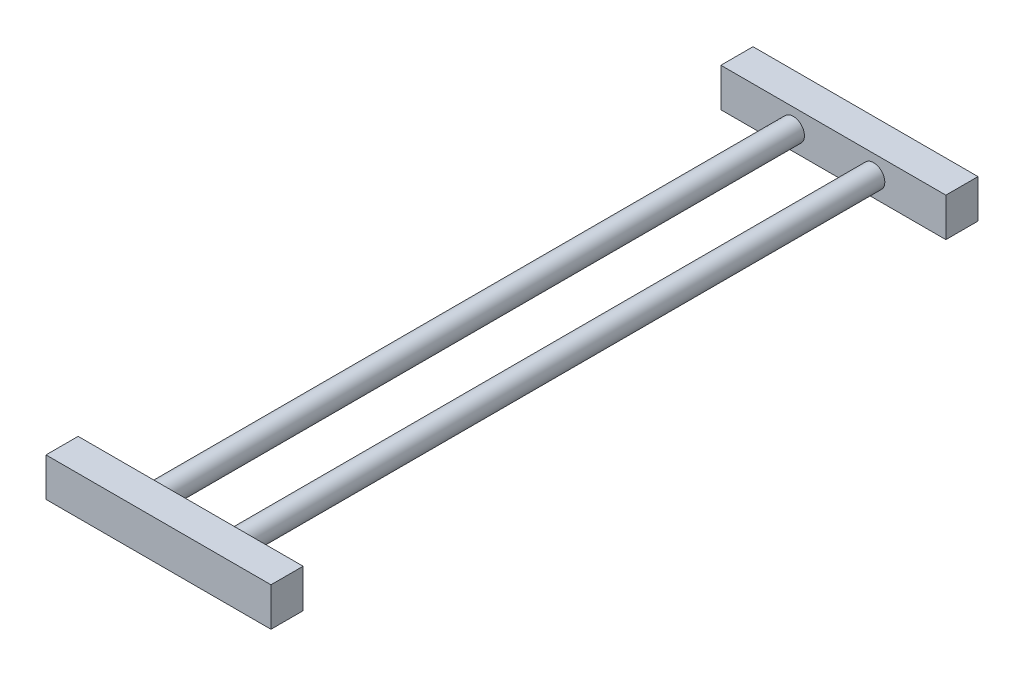
ISO-10303-21;
HEADER;
FILE_DESCRIPTION(('STEP AP214'),'2;1');
FILE_NAME('part.step','',(''),(''),'','','');
FILE_SCHEMA(('AUTOMOTIVE_DESIGN { 1 0 10303 214 1 1 1 1 }'));
ENDSEC;
DATA;
#1=APPLICATION_CONTEXT('core data for automotive mechanical design processes');
#2=APPLICATION_PROTOCOL_DEFINITION('international standard','automotive_design',2000,#1);
#3=PRODUCT_CONTEXT('',#1,'mechanical');
#4=PRODUCT('Part','Part','',(#3));
#5=PRODUCT_RELATED_PRODUCT_CATEGORY('part','',(#4));
#6=PRODUCT_DEFINITION_FORMATION('','',#4);
#7=PRODUCT_DEFINITION_CONTEXT('part definition',#1,'design');
#8=PRODUCT_DEFINITION('design','',#6,#7);
#9=PRODUCT_DEFINITION_SHAPE('','',#8);
#10=(LENGTH_UNIT() NAMED_UNIT(*) SI_UNIT(.MILLI.,.METRE.));
#11=(NAMED_UNIT(*) PLANE_ANGLE_UNIT() SI_UNIT($,.RADIAN.));
#12=(NAMED_UNIT(*) SI_UNIT($,.STERADIAN.) SOLID_ANGLE_UNIT());
#13=UNCERTAINTY_MEASURE_WITH_UNIT(LENGTH_MEASURE(1.E-05),#10,'distance_accuracy_value','');
#14=(GEOMETRIC_REPRESENTATION_CONTEXT(3) GLOBAL_UNCERTAINTY_ASSIGNED_CONTEXT((#13)) GLOBAL_UNIT_ASSIGNED_CONTEXT((#10,
#11,#12)) REPRESENTATION_CONTEXT('',''));
#15=CARTESIAN_POINT('',(0.,0.,0.));
#16=DIRECTION('',(0.,0.,1.));
#17=DIRECTION('',(1.,0.,0.));
#18=AXIS2_PLACEMENT_3D('',#15,#16,#17);
#19=CARTESIAN_POINT('',(-15.4706350510111,10.7368985325843,200.));
#20=DIRECTION('',(0.,0.,-1.));
#21=DIRECTION('',(-1.,0.,0.));
#22=AXIS2_PLACEMENT_3D('',#19,#20,#21);
#23=CYLINDRICAL_SURFACE('',#22,3.5);
#24=CARTESIAN_POINT('',(-15.4706350510111,10.7368985325843,200.));
#25=DIRECTION('',(0.,0.,1.));
#26=DIRECTION('',(1.,0.,0.));
#27=AXIS2_PLACEMENT_3D('',#24,#25,#26);
#28=CIRCLE('',#27,3.5);
#29=CARTESIAN_POINT('',(-11.9706350510111,10.7368985325843,200.));
#30=VERTEX_POINT('',#29);
#31=EDGE_CURVE('E42',#30,#30,#28,.T.);
#32=ORIENTED_EDGE('',*,*,#31,.F.);
#33=EDGE_LOOP('',(#32));
#34=FACE_BOUND('',#33,.T.);
#35=CARTESIAN_POINT('',(-15.4706350510111,10.7368985325843,0.));
#36=DIRECTION('',(0.,0.,1.));
#37=DIRECTION('',(1.,0.,0.));
#38=AXIS2_PLACEMENT_3D('',#35,#36,#37);
#39=CIRCLE('',#38,3.5);
#40=CARTESIAN_POINT('',(-11.9706350510111,10.7368985325843,0.));
#41=VERTEX_POINT('',#40);
#42=EDGE_CURVE('E163',#41,#41,#39,.T.);
#43=ORIENTED_EDGE('',*,*,#42,.T.);
#44=EDGE_LOOP('',(#43));
#45=FACE_BOUND('',#44,.T.);
#46=ADVANCED_FACE('F34',(#34,#45),#23,.T.);
#47=CARTESIAN_POINT('',(-37.9706350510111,4.73689853258425,-10.));
#48=DIRECTION('',(1.,0.,0.));
#49=DIRECTION('',(0.,1.,0.));
#50=AXIS2_PLACEMENT_3D('',#47,#48,#49);
#51=PLANE('',#50);
#52=DIRECTION('',(0.,1.,0.));
#53=VECTOR('',#52,1.);
#54=CARTESIAN_POINT('',(-37.9706350510111,4.73689853258425,0.));
#55=LINE('',#54,#53);
#56=CARTESIAN_POINT('',(-37.9706350510111,4.73689853258425,0.));
#57=VERTEX_POINT('',#56);
#58=CARTESIAN_POINT('',(-37.9706350510111,16.7368985325843,0.));
#59=VERTEX_POINT('',#58);
#60=EDGE_CURVE('E137',#57,#59,#55,.T.);
#61=ORIENTED_EDGE('',*,*,#60,.T.);
#62=DIRECTION('',(0.,0.,1.));
#63=VECTOR('',#62,1.);
#64=CARTESIAN_POINT('',(-37.9706350510111,16.7368985325843,-10.));
#65=LINE('',#64,#63);
#66=CARTESIAN_POINT('',(-37.9706350510111,16.7368985325843,-10.));
#67=VERTEX_POINT('',#66);
#68=EDGE_CURVE('E161',#67,#59,#65,.T.);
#69=ORIENTED_EDGE('',*,*,#68,.F.);
#70=DIRECTION('',(0.,1.,0.));
#71=VECTOR('',#70,1.);
#72=CARTESIAN_POINT('',(-37.9706350510111,4.73689853258425,-10.));
#73=LINE('',#72,#71);
#74=CARTESIAN_POINT('',(-37.9706350510111,4.73689853258425,-10.));
#75=VERTEX_POINT('',#74);
#76=EDGE_CURVE('E143',#75,#67,#73,.T.);
#77=ORIENTED_EDGE('',*,*,#76,.F.);
#78=DIRECTION('',(0.,0.,1.));
#79=VECTOR('',#78,1.);
#80=CARTESIAN_POINT('',(-37.9706350510111,4.73689853258425,-10.));
#81=LINE('',#80,#79);
#82=EDGE_CURVE('E149',#75,#57,#81,.T.);
#83=ORIENTED_EDGE('',*,*,#82,.T.);
#84=EDGE_LOOP('',(#61,#69,#77,#83));
#85=FACE_BOUND('',#84,.T.);
#86=ADVANCED_FACE('F179',(#85),#51,.F.);
#87=CARTESIAN_POINT('',(-37.9706350510111,16.7368985325843,-10.));
#88=DIRECTION('',(0.,-1.,0.));
#89=DIRECTION('',(1.,0.,0.));
#90=AXIS2_PLACEMENT_3D('',#87,#88,#89);
#91=PLANE('',#90);
#92=DIRECTION('',(1.,0.,0.));
#93=VECTOR('',#92,1.);
#94=CARTESIAN_POINT('',(-37.9706350510111,16.7368985325843,0.));
#95=LINE('',#94,#93);
#96=CARTESIAN_POINT('',(32.0293649489889,16.7368985325842,0.));
#97=VERTEX_POINT('',#96);
#98=EDGE_CURVE('E152',#59,#97,#95,.T.);
#99=ORIENTED_EDGE('',*,*,#98,.T.);
#100=DIRECTION('',(0.,0.,1.));
#101=VECTOR('',#100,1.);
#102=CARTESIAN_POINT('',(32.0293649489889,16.7368985325842,-10.));
#103=LINE('',#102,#101);
#104=CARTESIAN_POINT('',(32.0293649489889,16.7368985325842,-10.));
#105=VERTEX_POINT('',#104);
#106=EDGE_CURVE('E159',#105,#97,#103,.T.);
#107=ORIENTED_EDGE('',*,*,#106,.F.);
#108=DIRECTION('',(1.,0.,0.));
#109=VECTOR('',#108,1.);
#110=CARTESIAN_POINT('',(-37.9706350510111,16.7368985325843,-10.));
#111=LINE('',#110,#109);
#112=EDGE_CURVE('E82',#67,#105,#111,.T.);
#113=ORIENTED_EDGE('',*,*,#112,.F.);
#114=ORIENTED_EDGE('',*,*,#68,.T.);
#115=EDGE_LOOP('',(#99,#107,#113,#114));
#116=FACE_BOUND('',#115,.T.);
#117=ADVANCED_FACE('F184',(#116),#91,.F.);
#118=CARTESIAN_POINT('',(32.0293649489889,4.73689853258424,-10.));
#119=DIRECTION('',(-1.,0.,0.));
#120=DIRECTION('',(0.,0.,1.));
#121=AXIS2_PLACEMENT_3D('',#118,#119,#120);
#122=PLANE('',#121);
#123=DIRECTION('',(0.,-1.,0.));
#124=VECTOR('',#123,1.);
#125=CARTESIAN_POINT('',(32.0293649489889,4.73689853258424,0.));
#126=LINE('',#125,#124);
#127=CARTESIAN_POINT('',(32.0293649489889,4.73689853258424,0.));
#128=VERTEX_POINT('',#127);
#129=EDGE_CURVE('E68',#97,#128,#126,.T.);
#130=ORIENTED_EDGE('',*,*,#129,.T.);
#131=DIRECTION('',(0.,0.,1.));
#132=VECTOR('',#131,1.);
#133=CARTESIAN_POINT('',(32.0293649489889,4.73689853258424,-10.));
#134=LINE('',#133,#132);
#135=CARTESIAN_POINT('',(32.0293649489889,4.73689853258424,-10.));
#136=VERTEX_POINT('',#135);
#137=EDGE_CURVE('E157',#136,#128,#134,.T.);
#138=ORIENTED_EDGE('',*,*,#137,.F.);
#139=DIRECTION('',(0.,-1.,0.));
#140=VECTOR('',#139,1.);
#141=CARTESIAN_POINT('',(32.0293649489889,4.73689853258424,-10.));
#142=LINE('',#141,#140);
#143=EDGE_CURVE('E146',#105,#136,#142,.T.);
#144=ORIENTED_EDGE('',*,*,#143,.F.);
#145=ORIENTED_EDGE('',*,*,#106,.T.);
#146=EDGE_LOOP('',(#130,#138,#144,#145));
#147=FACE_BOUND('',#146,.T.);
#148=ADVANCED_FACE('F183',(#147),#122,.F.);
#149=CARTESIAN_POINT('',(-37.9706350510111,4.73689853258425,-10.));
#150=DIRECTION('',(0.,1.,0.));
#151=DIRECTION('',(-1.,0.,0.));
#152=AXIS2_PLACEMENT_3D('',#149,#150,#151);
#153=PLANE('',#152);
#154=DIRECTION('',(-1.,0.,0.));
#155=VECTOR('',#154,1.);
#156=CARTESIAN_POINT('',(-37.9706350510111,4.73689853258425,0.));
#157=LINE('',#156,#155);
#158=EDGE_CURVE('E74',#128,#57,#157,.T.);
#159=ORIENTED_EDGE('',*,*,#158,.T.);
#160=ORIENTED_EDGE('',*,*,#82,.F.);
#161=DIRECTION('',(-1.,0.,0.));
#162=VECTOR('',#161,1.);
#163=CARTESIAN_POINT('',(-37.9706350510111,4.73689853258425,-10.));
#164=LINE('',#163,#162);
#165=EDGE_CURVE('E50',#136,#75,#164,.T.);
#166=ORIENTED_EDGE('',*,*,#165,.F.);
#167=ORIENTED_EDGE('',*,*,#137,.T.);
#168=EDGE_LOOP('',(#159,#160,#166,#167));
#169=FACE_BOUND('',#168,.T.);
#170=ADVANCED_FACE('F181',(#169),#153,.F.);
#171=CARTESIAN_POINT('',(0.,0.,-10.));
#172=DIRECTION('',(0.,0.,-1.));
#173=DIRECTION('',(-1.,0.,0.));
#174=AXIS2_PLACEMENT_3D('',#171,#172,#173);
#175=PLANE('',#174);
#176=ORIENTED_EDGE('',*,*,#76,.T.);
#177=ORIENTED_EDGE('',*,*,#112,.T.);
#178=ORIENTED_EDGE('',*,*,#143,.T.);
#179=ORIENTED_EDGE('',*,*,#165,.T.);
#180=EDGE_LOOP('',(#176,#177,#178,#179));
#181=FACE_BOUND('',#180,.T.);
#182=ADVANCED_FACE('F173',(#181),#175,.T.);
#183=CARTESIAN_POINT('',(0.,0.,0.));
#184=DIRECTION('',(0.,0.,-1.));
#185=DIRECTION('',(-1.,0.,0.));
#186=AXIS2_PLACEMENT_3D('',#183,#184,#185);
#187=PLANE('',#186);
#188=CARTESIAN_POINT('',(9.52936494898893,10.7368985325843,0.));
#189=DIRECTION('',(0.,0.,-1.));
#190=DIRECTION('',(-1.,0.,0.));
#191=AXIS2_PLACEMENT_3D('',#188,#189,#190);
#192=CIRCLE('',#191,3.5);
#193=CARTESIAN_POINT('',(6.02936494898893,10.7368985325843,0.));
#194=VERTEX_POINT('',#193);
#195=EDGE_CURVE('E11',#194,#194,#192,.F.);
#196=ORIENTED_EDGE('',*,*,#195,.F.);
#197=EDGE_LOOP('',(#196));
#198=FACE_BOUND('',#197,.T.);
#199=ORIENTED_EDGE('',*,*,#42,.F.);
#200=EDGE_LOOP('',(#199));
#201=FACE_BOUND('',#200,.T.);
#202=ORIENTED_EDGE('',*,*,#60,.F.);
#203=ORIENTED_EDGE('',*,*,#158,.F.);
#204=ORIENTED_EDGE('',*,*,#129,.F.);
#205=ORIENTED_EDGE('',*,*,#98,.F.);
#206=EDGE_LOOP('',(#202,#203,#204,#205));
#207=FACE_BOUND('',#206,.T.);
#208=ADVANCED_FACE('F169',(#198,#201,#207),#187,.F.);
#209=CARTESIAN_POINT('',(9.52936494898893,10.7368985325843,200.));
#210=DIRECTION('',(0.,0.,-1.));
#211=DIRECTION('',(-1.,0.,0.));
#212=AXIS2_PLACEMENT_3D('',#209,#210,#211);
#213=CYLINDRICAL_SURFACE('',#212,3.5);
#214=CARTESIAN_POINT('',(9.52936494898893,10.7368985325843,200.));
#215=DIRECTION('',(0.,0.,1.));
#216=DIRECTION('',(1.,0.,0.));
#217=AXIS2_PLACEMENT_3D('',#214,#215,#216);
#218=CIRCLE('',#217,3.5);
#219=CARTESIAN_POINT('',(13.0293649489889,10.7368985325843,200.));
#220=VERTEX_POINT('',#219);
#221=EDGE_CURVE('E134',#220,#220,#218,.T.);
#222=ORIENTED_EDGE('',*,*,#221,.F.);
#223=EDGE_LOOP('',(#222));
#224=FACE_BOUND('',#223,.T.);
#225=ORIENTED_EDGE('',*,*,#195,.T.);
#226=EDGE_LOOP('',(#225));
#227=FACE_BOUND('',#226,.T.);
#228=ADVANCED_FACE('F172',(#224,#227),#213,.T.);
#229=CARTESIAN_POINT('',(32.0293649489889,16.7368985325842,210.));
#230=DIRECTION('',(0.,-1.,0.));
#231=DIRECTION('',(1.,0.,0.));
#232=AXIS2_PLACEMENT_3D('',#229,#230,#231);
#233=PLANE('',#232);
#234=DIRECTION('',(-1.,0.,0.));
#235=VECTOR('',#234,1.);
#236=CARTESIAN_POINT('',(32.0293649489889,16.7368985325842,200.));
#237=LINE('',#236,#235);
#238=CARTESIAN_POINT('',(32.0293649489889,16.7368985325842,200.));
#239=VERTEX_POINT('',#238);
#240=CARTESIAN_POINT('',(-37.9706350510111,16.7368985325843,200.));
#241=VERTEX_POINT('',#240);
#242=EDGE_CURVE('E133',#239,#241,#237,.T.);
#243=ORIENTED_EDGE('',*,*,#242,.T.);
#244=DIRECTION('',(0.,0.,-1.));
#245=VECTOR('',#244,1.);
#246=CARTESIAN_POINT('',(-37.9706350510111,16.7368985325843,210.));
#247=LINE('',#246,#245);
#248=CARTESIAN_POINT('',(-37.9706350510111,16.7368985325843,210.));
#249=VERTEX_POINT('',#248);
#250=EDGE_CURVE('E113',#249,#241,#247,.T.);
#251=ORIENTED_EDGE('',*,*,#250,.F.);
#252=DIRECTION('',(-1.,0.,0.));
#253=VECTOR('',#252,1.);
#254=CARTESIAN_POINT('',(32.0293649489889,16.7368985325842,210.));
#255=LINE('',#254,#253);
#256=CARTESIAN_POINT('',(32.0293649489889,16.7368985325842,210.));
#257=VERTEX_POINT('',#256);
#258=EDGE_CURVE('E120',#257,#249,#255,.T.);
#259=ORIENTED_EDGE('',*,*,#258,.F.);
#260=DIRECTION('',(0.,0.,-1.));
#261=VECTOR('',#260,1.);
#262=CARTESIAN_POINT('',(32.0293649489889,16.7368985325842,210.));
#263=LINE('',#262,#261);
#264=EDGE_CURVE('E215',#257,#239,#263,.T.);
#265=ORIENTED_EDGE('',*,*,#264,.T.);
#266=EDGE_LOOP('',(#243,#251,#259,#265));
#267=FACE_BOUND('',#266,.T.);
#268=ADVANCED_FACE('F131',(#267),#233,.F.);
#269=CARTESIAN_POINT('',(-37.9706350510111,16.7368985325843,210.));
#270=DIRECTION('',(1.,0.,0.));
#271=DIRECTION('',(0.,1.,0.));
#272=AXIS2_PLACEMENT_3D('',#269,#270,#271);
#273=PLANE('',#272);
#274=DIRECTION('',(0.,-1.,0.));
#275=VECTOR('',#274,1.);
#276=CARTESIAN_POINT('',(-37.9706350510111,16.7368985325843,200.));
#277=LINE('',#276,#275);
#278=CARTESIAN_POINT('',(-37.9706350510111,4.73689853258425,200.));
#279=VERTEX_POINT('',#278);
#280=EDGE_CURVE('E206',#241,#279,#277,.T.);
#281=ORIENTED_EDGE('',*,*,#280,.T.);
#282=DIRECTION('',(0.,0.,-1.));
#283=VECTOR('',#282,1.);
#284=CARTESIAN_POINT('',(-37.9706350510111,4.73689853258425,210.));
#285=LINE('',#284,#283);
#286=CARTESIAN_POINT('',(-37.9706350510111,4.73689853258425,210.));
#287=VERTEX_POINT('',#286);
#288=EDGE_CURVE('E116',#287,#279,#285,.T.);
#289=ORIENTED_EDGE('',*,*,#288,.F.);
#290=DIRECTION('',(0.,-1.,0.));
#291=VECTOR('',#290,1.);
#292=CARTESIAN_POINT('',(-37.9706350510111,16.7368985325843,210.));
#293=LINE('',#292,#291);
#294=EDGE_CURVE('E109',#249,#287,#293,.T.);
#295=ORIENTED_EDGE('',*,*,#294,.F.);
#296=ORIENTED_EDGE('',*,*,#250,.T.);
#297=EDGE_LOOP('',(#281,#289,#295,#296));
#298=FACE_BOUND('',#297,.T.);
#299=ADVANCED_FACE('F111',(#298),#273,.F.);
#300=CARTESIAN_POINT('',(-37.9706350510111,4.73689853258425,210.));
#301=DIRECTION('',(0.,1.,0.));
#302=DIRECTION('',(-1.,0.,0.));
#303=AXIS2_PLACEMENT_3D('',#300,#301,#302);
#304=PLANE('',#303);
#305=DIRECTION('',(1.,0.,0.));
#306=VECTOR('',#305,1.);
#307=CARTESIAN_POINT('',(-37.9706350510111,4.73689853258425,200.));
#308=LINE('',#307,#306);
#309=CARTESIAN_POINT('',(32.0293649489889,4.73689853258424,200.));
#310=VERTEX_POINT('',#309);
#311=EDGE_CURVE('E208',#279,#310,#308,.T.);
#312=ORIENTED_EDGE('',*,*,#311,.T.);
#313=DIRECTION('',(0.,0.,-1.));
#314=VECTOR('',#313,1.);
#315=CARTESIAN_POINT('',(32.0293649489889,4.73689853258424,210.));
#316=LINE('',#315,#314);
#317=CARTESIAN_POINT('',(32.0293649489889,4.73689853258424,210.));
#318=VERTEX_POINT('',#317);
#319=EDGE_CURVE('E139',#318,#310,#316,.T.);
#320=ORIENTED_EDGE('',*,*,#319,.F.);
#321=DIRECTION('',(1.,0.,0.));
#322=VECTOR('',#321,1.);
#323=CARTESIAN_POINT('',(-37.9706350510111,4.73689853258425,210.));
#324=LINE('',#323,#322);
#325=EDGE_CURVE('E119',#287,#318,#324,.T.);
#326=ORIENTED_EDGE('',*,*,#325,.F.);
#327=ORIENTED_EDGE('',*,*,#288,.T.);
#328=EDGE_LOOP('',(#312,#320,#326,#327));
#329=FACE_BOUND('',#328,.T.);
#330=ADVANCED_FACE('F221',(#329),#304,.F.);
#331=CARTESIAN_POINT('',(32.0293649489889,4.73689853258424,210.));
#332=DIRECTION('',(-1.,0.,0.));
#333=DIRECTION('',(0.,0.,1.));
#334=AXIS2_PLACEMENT_3D('',#331,#332,#333);
#335=PLANE('',#334);
#336=DIRECTION('',(0.,1.,0.));
#337=VECTOR('',#336,1.);
#338=CARTESIAN_POINT('',(32.0293649489889,4.73689853258424,200.));
#339=LINE('',#338,#337);
#340=EDGE_CURVE('E129',#310,#239,#339,.T.);
#341=ORIENTED_EDGE('',*,*,#340,.T.);
#342=ORIENTED_EDGE('',*,*,#264,.F.);
#343=DIRECTION('',(0.,1.,0.));
#344=VECTOR('',#343,1.);
#345=CARTESIAN_POINT('',(32.0293649489889,4.73689853258424,210.));
#346=LINE('',#345,#344);
#347=EDGE_CURVE('E125',#318,#257,#346,.T.);
#348=ORIENTED_EDGE('',*,*,#347,.F.);
#349=ORIENTED_EDGE('',*,*,#319,.T.);
#350=EDGE_LOOP('',(#341,#342,#348,#349));
#351=FACE_BOUND('',#350,.T.);
#352=ADVANCED_FACE('F219',(#351),#335,.F.);
#353=CARTESIAN_POINT('',(0.,0.,210.));
#354=DIRECTION('',(0.,0.,1.));
#355=DIRECTION('',(1.,0.,0.));
#356=AXIS2_PLACEMENT_3D('',#353,#354,#355);
#357=PLANE('',#356);
#358=ORIENTED_EDGE('',*,*,#258,.T.);
#359=ORIENTED_EDGE('',*,*,#294,.T.);
#360=ORIENTED_EDGE('',*,*,#325,.T.);
#361=ORIENTED_EDGE('',*,*,#347,.T.);
#362=EDGE_LOOP('',(#358,#359,#360,#361));
#363=FACE_BOUND('',#362,.T.);
#364=ADVANCED_FACE('F123',(#363),#357,.T.);
#365=CARTESIAN_POINT('',(0.,0.,200.));
#366=DIRECTION('',(0.,0.,1.));
#367=DIRECTION('',(1.,0.,0.));
#368=AXIS2_PLACEMENT_3D('',#365,#366,#367);
#369=PLANE('',#368);
#370=ORIENTED_EDGE('',*,*,#31,.T.);
#371=EDGE_LOOP('',(#370));
#372=FACE_BOUND('',#371,.T.);
#373=ORIENTED_EDGE('',*,*,#221,.T.);
#374=EDGE_LOOP('',(#373));
#375=FACE_BOUND('',#374,.T.);
#376=ORIENTED_EDGE('',*,*,#242,.F.);
#377=ORIENTED_EDGE('',*,*,#340,.F.);
#378=ORIENTED_EDGE('',*,*,#311,.F.);
#379=ORIENTED_EDGE('',*,*,#280,.F.);
#380=EDGE_LOOP('',(#376,#377,#378,#379));
#381=FACE_BOUND('',#380,.T.);
#382=ADVANCED_FACE('F198',(#372,#375,#381),#369,.F.);
#383=CLOSED_SHELL('',(#46,#86,#117,#148,#170,#182,#208,#228,#268,#299,#330,#352,#364,#382));
#384=MANIFOLD_SOLID_BREP('B2',#383);
#385=ADVANCED_BREP_SHAPE_REPRESENTATION('',(#18,#384),#14);
#386=SHAPE_DEFINITION_REPRESENTATION(#9,#385);
ENDSEC;
END-ISO-10303-21;
